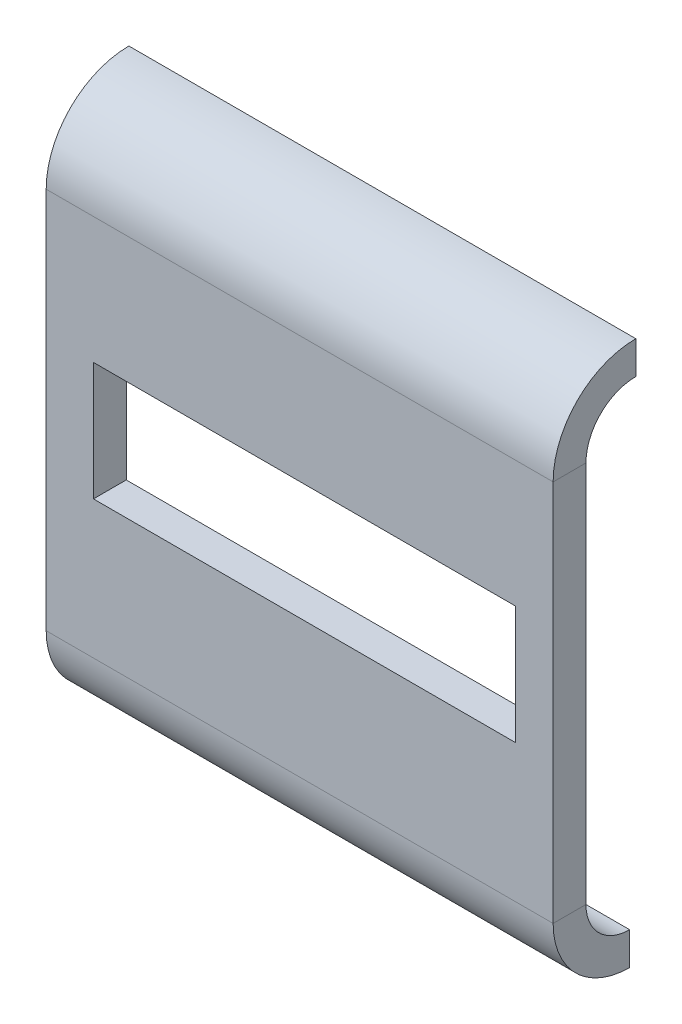
ISO-10303-21;
HEADER;
FILE_DESCRIPTION(('STEP AP214'),'2;1');
FILE_NAME('part.step','',(''),(''),'','','');
FILE_SCHEMA(('AUTOMOTIVE_DESIGN { 1 0 10303 214 1 1 1 1 }'));
ENDSEC;
DATA;
#1=APPLICATION_CONTEXT('core data for automotive mechanical design processes');
#2=APPLICATION_PROTOCOL_DEFINITION('international standard','automotive_design',2000,#1);
#3=PRODUCT_CONTEXT('',#1,'mechanical');
#4=PRODUCT('Part','Part','',(#3));
#5=PRODUCT_RELATED_PRODUCT_CATEGORY('part','',(#4));
#6=PRODUCT_DEFINITION_FORMATION('','',#4);
#7=PRODUCT_DEFINITION_CONTEXT('part definition',#1,'design');
#8=PRODUCT_DEFINITION('design','',#6,#7);
#9=PRODUCT_DEFINITION_SHAPE('','',#8);
#10=(LENGTH_UNIT() NAMED_UNIT(*) SI_UNIT(.MILLI.,.METRE.));
#11=(NAMED_UNIT(*) PLANE_ANGLE_UNIT() SI_UNIT($,.RADIAN.));
#12=(NAMED_UNIT(*) SI_UNIT($,.STERADIAN.) SOLID_ANGLE_UNIT());
#13=UNCERTAINTY_MEASURE_WITH_UNIT(LENGTH_MEASURE(1.E-05),#10,'distance_accuracy_value','');
#14=(GEOMETRIC_REPRESENTATION_CONTEXT(3) GLOBAL_UNCERTAINTY_ASSIGNED_CONTEXT((#13)) GLOBAL_UNIT_ASSIGNED_CONTEXT((#10,
#11,#12)) REPRESENTATION_CONTEXT('',''));
#15=CARTESIAN_POINT('',(0.,0.,0.));
#16=DIRECTION('',(0.,0.,1.));
#17=DIRECTION('',(1.,0.,0.));
#18=AXIS2_PLACEMENT_3D('',#15,#16,#17);
#19=CARTESIAN_POINT('',(3.77338304546715,-89.1498756984959,-22.54));
#20=DIRECTION('',(0.,0.,-1.));
#21=DIRECTION('',(1.,0.,0.));
#22=AXIS2_PLACEMENT_3D('',#19,#20,#21);
#23=PLANE('',#22);
#24=DIRECTION('',(0.,-1.,0.));
#25=VECTOR('',#24,1.);
#26=CARTESIAN_POINT('',(-79.3353785309465,-89.1498756984959,-22.54));
#27=LINE('',#26,#25);
#28=CARTESIAN_POINT('',(-79.3353785309465,-78.3878756984958,-22.54));
#29=VERTEX_POINT('',#28);
#30=CARTESIAN_POINT('',(-79.3353785309465,-89.1498756984959,-22.54));
#31=VERTEX_POINT('',#30);
#32=EDGE_CURVE('E235',#29,#31,#27,.T.);
#33=ORIENTED_EDGE('',*,*,#32,.F.);
#34=DIRECTION('',(-1.,0.,0.));
#35=VECTOR('',#34,1.);
#36=CARTESIAN_POINT('',(0.,-78.3878756984958,-22.54));
#37=LINE('',#36,#35);
#38=CARTESIAN_POINT('',(86.8821446218808,-78.3878756984958,-22.54));
#39=VERTEX_POINT('',#38);
#40=EDGE_CURVE('E209',#29,#39,#37,.F.);
#41=ORIENTED_EDGE('',*,*,#40,.T.);
#42=DIRECTION('',(0.,-1.,0.));
#43=VECTOR('',#42,1.);
#44=CARTESIAN_POINT('',(86.8821446218808,-89.1498756984959,-22.54));
#45=LINE('',#44,#43);
#46=CARTESIAN_POINT('',(86.8821446218808,-89.1498756984959,-22.54));
#47=VERTEX_POINT('',#46);
#48=EDGE_CURVE('E233',#39,#47,#45,.T.);
#49=ORIENTED_EDGE('',*,*,#48,.T.);
#50=DIRECTION('',(1.,0.,0.));
#51=VECTOR('',#50,1.);
#52=CARTESIAN_POINT('',(-79.3353785309465,-89.1498756984959,-22.54));
#53=LINE('',#52,#51);
#54=EDGE_CURVE('E178',#31,#47,#53,.T.);
#55=ORIENTED_EDGE('',*,*,#54,.F.);
#56=EDGE_LOOP('',(#33,#41,#49,#55));
#57=FACE_BOUND('',#56,.T.);
#58=ADVANCED_FACE('F45',(#57),#23,.T.);
#59=CARTESIAN_POINT('',(86.8821446218808,-64.0698756984958,-22.54));
#60=DIRECTION('',(-1.,0.,0.));
#61=DIRECTION('',(0.,0.,1.));
#62=AXIS2_PLACEMENT_3D('',#59,#60,#61);
#63=PLANE('',#62);
#64=ORIENTED_EDGE('',*,*,#48,.F.);
#65=CARTESIAN_POINT('',(86.8821446218808,-64.0698756984958,-22.54));
#66=DIRECTION('',(-1.,0.,0.));
#67=DIRECTION('',(0.,0.,1.));
#68=AXIS2_PLACEMENT_3D('',#65,#66,#67);
#69=CIRCLE('',#68,14.318);
#70=CARTESIAN_POINT('',(86.8821446218808,-64.0698756984958,-8.222));
#71=VERTEX_POINT('',#70);
#72=EDGE_CURVE('E160',#39,#71,#69,.T.);
#73=ORIENTED_EDGE('',*,*,#72,.T.);
#74=DIRECTION('',(0.,0.,1.));
#75=VECTOR('',#74,1.);
#76=CARTESIAN_POINT('',(86.8821446218808,-64.0698756984958,2.54));
#77=LINE('',#76,#75);
#78=CARTESIAN_POINT('',(86.8821446218808,-64.0698756984958,2.54));
#79=VERTEX_POINT('',#78);
#80=EDGE_CURVE('E231',#71,#79,#77,.T.);
#81=ORIENTED_EDGE('',*,*,#80,.T.);
#82=CARTESIAN_POINT('',(86.8821446218808,-64.0698756984958,-22.54));
#83=DIRECTION('',(1.,0.,0.));
#84=DIRECTION('',(0.,0.,-1.));
#85=AXIS2_PLACEMENT_3D('',#82,#83,#84);
#86=CIRCLE('',#85,25.08);
#87=EDGE_CURVE('E186',#47,#79,#86,.F.);
#88=ORIENTED_EDGE('',*,*,#87,.F.);
#89=EDGE_LOOP('',(#64,#73,#81,#88));
#90=FACE_BOUND('',#89,.T.);
#91=ADVANCED_FACE('F263',(#90),#63,.F.);
#92=CARTESIAN_POINT('',(86.8821446218808,88.4148194522112,2.54));
#93=DIRECTION('',(1.,0.,0.));
#94=DIRECTION('',(0.,1.,0.));
#95=AXIS2_PLACEMENT_3D('',#92,#93,#94);
#96=PLANE('',#95);
#97=ORIENTED_EDGE('',*,*,#80,.F.);
#98=DIRECTION('',(0.,1.,0.));
#99=VECTOR('',#98,1.);
#100=CARTESIAN_POINT('',(86.8821446218808,0.,-8.222));
#101=LINE('',#100,#99);
#102=CARTESIAN_POINT('',(86.8821446218808,61.3028194522112,-8.222));
#103=VERTEX_POINT('',#102);
#104=EDGE_CURVE('E200',#71,#103,#101,.T.);
#105=ORIENTED_EDGE('',*,*,#104,.T.);
#106=DIRECTION('',(0.,0.,1.));
#107=VECTOR('',#106,1.);
#108=CARTESIAN_POINT('',(86.8821446218808,61.3028194522112,2.54));
#109=LINE('',#108,#107);
#110=CARTESIAN_POINT('',(86.8821446218808,61.3028194522112,2.54));
#111=VERTEX_POINT('',#110);
#112=EDGE_CURVE('E229',#103,#111,#109,.T.);
#113=ORIENTED_EDGE('',*,*,#112,.T.);
#114=DIRECTION('',(0.,1.,0.));
#115=VECTOR('',#114,1.);
#116=CARTESIAN_POINT('',(86.8821446218808,88.4148194522112,2.54));
#117=LINE('',#116,#115);
#118=EDGE_CURVE('E166',#79,#111,#117,.T.);
#119=ORIENTED_EDGE('',*,*,#118,.F.);
#120=EDGE_LOOP('',(#97,#105,#113,#119));
#121=FACE_BOUND('',#120,.T.);
#122=ADVANCED_FACE('F268',(#121),#96,.T.);
#123=CARTESIAN_POINT('',(86.8821446218808,61.3028194522112,-24.572));
#124=DIRECTION('',(-1.,0.,0.));
#125=DIRECTION('',(0.,0.,1.));
#126=AXIS2_PLACEMENT_3D('',#123,#124,#125);
#127=PLANE('',#126);
#128=ORIENTED_EDGE('',*,*,#112,.F.);
#129=CARTESIAN_POINT('',(86.8821446218808,61.3028194522112,-24.572));
#130=DIRECTION('',(1.,0.,0.));
#131=DIRECTION('',(0.,0.,-1.));
#132=AXIS2_PLACEMENT_3D('',#129,#130,#131);
#133=CIRCLE('',#132,16.35);
#134=CARTESIAN_POINT('',(86.8821446218808,77.6528194522112,-24.572));
#135=VERTEX_POINT('',#134);
#136=EDGE_CURVE('E208',#103,#135,#133,.F.);
#137=ORIENTED_EDGE('',*,*,#136,.T.);
#138=DIRECTION('',(0.,1.,0.));
#139=VECTOR('',#138,1.);
#140=CARTESIAN_POINT('',(86.8821446218808,88.4148194522112,-24.572));
#141=LINE('',#140,#139);
#142=CARTESIAN_POINT('',(86.8821446218808,88.4148194522112,-24.572));
#143=VERTEX_POINT('',#142);
#144=EDGE_CURVE('E227',#135,#143,#141,.T.);
#145=ORIENTED_EDGE('',*,*,#144,.T.);
#146=CARTESIAN_POINT('',(86.8821446218808,61.3028194522112,-24.572));
#147=DIRECTION('',(1.,0.,0.));
#148=DIRECTION('',(0.,0.,-1.));
#149=AXIS2_PLACEMENT_3D('',#146,#147,#148);
#150=CIRCLE('',#149,27.112);
#151=EDGE_CURVE('E177',#111,#143,#150,.F.);
#152=ORIENTED_EDGE('',*,*,#151,.F.);
#153=EDGE_LOOP('',(#128,#137,#145,#152));
#154=FACE_BOUND('',#153,.T.);
#155=ADVANCED_FACE('F274',(#154),#127,.F.);
#156=CARTESIAN_POINT('',(3.77338304546714,88.4148194522112,-24.572));
#157=DIRECTION('',(0.,0.,-1.));
#158=DIRECTION('',(-1.,0.,0.));
#159=AXIS2_PLACEMENT_3D('',#156,#157,#158);
#160=PLANE('',#159);
#161=ORIENTED_EDGE('',*,*,#144,.F.);
#162=DIRECTION('',(1.,0.,0.));
#163=VECTOR('',#162,1.);
#164=CARTESIAN_POINT('',(0.,77.6528194522112,-24.572));
#165=LINE('',#164,#163);
#166=CARTESIAN_POINT('',(-79.3353785309465,77.6528194522112,-24.572));
#167=VERTEX_POINT('',#166);
#168=EDGE_CURVE('E204',#135,#167,#165,.F.);
#169=ORIENTED_EDGE('',*,*,#168,.T.);
#170=DIRECTION('',(0.,1.,0.));
#171=VECTOR('',#170,1.);
#172=CARTESIAN_POINT('',(-79.3353785309465,88.4148194522112,-24.572));
#173=LINE('',#172,#171);
#174=CARTESIAN_POINT('',(-79.3353785309465,88.4148194522112,-24.572));
#175=VERTEX_POINT('',#174);
#176=EDGE_CURVE('E225',#167,#175,#173,.T.);
#177=ORIENTED_EDGE('',*,*,#176,.T.);
#178=DIRECTION('',(-1.,0.,0.));
#179=VECTOR('',#178,1.);
#180=CARTESIAN_POINT('',(86.8821446218808,88.4148194522112,-24.572));
#181=LINE('',#180,#179);
#182=EDGE_CURVE('E167',#143,#175,#181,.T.);
#183=ORIENTED_EDGE('',*,*,#182,.F.);
#184=EDGE_LOOP('',(#161,#169,#177,#183));
#185=FACE_BOUND('',#184,.T.);
#186=ADVANCED_FACE('F278',(#185),#160,.T.);
#187=CARTESIAN_POINT('',(-79.3353785309465,61.3028194522112,-24.572));
#188=DIRECTION('',(1.,0.,0.));
#189=DIRECTION('',(0.,0.,-1.));
#190=AXIS2_PLACEMENT_3D('',#187,#188,#189);
#191=PLANE('',#190);
#192=ORIENTED_EDGE('',*,*,#176,.F.);
#193=CARTESIAN_POINT('',(-79.3353785309465,61.3028194522112,-24.572));
#194=DIRECTION('',(1.,0.,0.));
#195=DIRECTION('',(0.,0.,-1.));
#196=AXIS2_PLACEMENT_3D('',#193,#194,#195);
#197=CIRCLE('',#196,16.35);
#198=CARTESIAN_POINT('',(-79.3353785309465,61.3028194522112,-8.222));
#199=VERTEX_POINT('',#198);
#200=EDGE_CURVE('E205',#167,#199,#197,.T.);
#201=ORIENTED_EDGE('',*,*,#200,.T.);
#202=DIRECTION('',(0.,0.,1.));
#203=VECTOR('',#202,1.);
#204=CARTESIAN_POINT('',(-79.3353785309465,61.3028194522112,2.54));
#205=LINE('',#204,#203);
#206=CARTESIAN_POINT('',(-79.3353785309465,61.3028194522112,2.54));
#207=VERTEX_POINT('',#206);
#208=EDGE_CURVE('E223',#199,#207,#205,.T.);
#209=ORIENTED_EDGE('',*,*,#208,.T.);
#210=CARTESIAN_POINT('',(-79.3353785309465,61.3028194522112,-24.572));
#211=DIRECTION('',(-1.,0.,0.));
#212=DIRECTION('',(0.,0.,1.));
#213=AXIS2_PLACEMENT_3D('',#210,#211,#212);
#214=CIRCLE('',#213,27.112);
#215=EDGE_CURVE('E174',#175,#207,#214,.F.);
#216=ORIENTED_EDGE('',*,*,#215,.F.);
#217=EDGE_LOOP('',(#192,#201,#209,#216));
#218=FACE_BOUND('',#217,.T.);
#219=ADVANCED_FACE('F282',(#218),#191,.F.);
#220=CARTESIAN_POINT('',(-79.3353785309465,88.4148194522112,2.54));
#221=DIRECTION('',(-1.,0.,0.));
#222=DIRECTION('',(0.,-1.,0.));
#223=AXIS2_PLACEMENT_3D('',#220,#221,#222);
#224=PLANE('',#223);
#225=ORIENTED_EDGE('',*,*,#208,.F.);
#226=DIRECTION('',(0.,1.,0.));
#227=VECTOR('',#226,1.);
#228=CARTESIAN_POINT('',(-79.3353785309465,0.,-8.222));
#229=LINE('',#228,#227);
#230=CARTESIAN_POINT('',(-79.3353785309465,-64.0698756984958,-8.222));
#231=VERTEX_POINT('',#230);
#232=EDGE_CURVE('E201',#199,#231,#229,.F.);
#233=ORIENTED_EDGE('',*,*,#232,.T.);
#234=DIRECTION('',(0.,0.,1.));
#235=VECTOR('',#234,1.);
#236=CARTESIAN_POINT('',(-79.3353785309465,-64.0698756984958,2.54));
#237=LINE('',#236,#235);
#238=CARTESIAN_POINT('',(-79.3353785309465,-64.0698756984958,2.54));
#239=VERTEX_POINT('',#238);
#240=EDGE_CURVE('E185',#231,#239,#237,.T.);
#241=ORIENTED_EDGE('',*,*,#240,.T.);
#242=DIRECTION('',(0.,-1.,0.));
#243=VECTOR('',#242,1.);
#244=CARTESIAN_POINT('',(-79.3353785309465,88.4148194522112,2.54));
#245=LINE('',#244,#243);
#246=EDGE_CURVE('E163',#207,#239,#245,.T.);
#247=ORIENTED_EDGE('',*,*,#246,.F.);
#248=EDGE_LOOP('',(#225,#233,#241,#247));
#249=FACE_BOUND('',#248,.T.);
#250=ADVANCED_FACE('F286',(#249),#224,.T.);
#251=CARTESIAN_POINT('',(-79.3353785309465,-64.0698756984958,-22.54));
#252=DIRECTION('',(1.,0.,0.));
#253=DIRECTION('',(0.,0.,-1.));
#254=AXIS2_PLACEMENT_3D('',#251,#252,#253);
#255=PLANE('',#254);
#256=CARTESIAN_POINT('',(-79.3353785309465,-64.0698756984958,-22.54));
#257=DIRECTION('',(-1.,0.,0.));
#258=DIRECTION('',(0.,0.,1.));
#259=AXIS2_PLACEMENT_3D('',#256,#257,#258);
#260=CIRCLE('',#259,14.318);
#261=EDGE_CURVE('E218',#231,#29,#260,.F.);
#262=ORIENTED_EDGE('',*,*,#261,.T.);
#263=ORIENTED_EDGE('',*,*,#32,.T.);
#264=CARTESIAN_POINT('',(-79.3353785309465,-64.0698756984958,-22.54));
#265=DIRECTION('',(-1.,0.,0.));
#266=DIRECTION('',(0.,0.,1.));
#267=AXIS2_PLACEMENT_3D('',#264,#265,#266);
#268=CIRCLE('',#267,25.08);
#269=EDGE_CURVE('E189',#239,#31,#268,.F.);
#270=ORIENTED_EDGE('',*,*,#269,.F.);
#271=ORIENTED_EDGE('',*,*,#240,.F.);
#272=EDGE_LOOP('',(#262,#263,#270,#271));
#273=FACE_BOUND('',#272,.T.);
#274=ADVANCED_FACE('F47',(#273),#255,.F.);
#275=CARTESIAN_POINT('',(0.,0.,2.54));
#276=DIRECTION('',(0.,0.,1.));
#277=DIRECTION('',(1.,0.,0.));
#278=AXIS2_PLACEMENT_3D('',#275,#276,#277);
#279=PLANE('',#278);
#280=DIRECTION('',(0.,-1.,0.));
#281=VECTOR('',#280,1.);
#282=CARTESIAN_POINT('',(-63.8420034546598,19.878114837816,2.54));
#283=LINE('',#282,#281);
#284=CARTESIAN_POINT('',(-63.8420034546598,19.878114837816,2.54));
#285=VERTEX_POINT('',#284);
#286=CARTESIAN_POINT('',(-63.8420034546598,-18.8845321570687,2.54));
#287=VERTEX_POINT('',#286);
#288=EDGE_CURVE('E60',#285,#287,#283,.T.);
#289=ORIENTED_EDGE('',*,*,#288,.F.);
#290=DIRECTION('',(-1.,0.,0.));
#291=VECTOR('',#290,1.);
#292=CARTESIAN_POINT('',(-63.8420034546598,19.878114837816,2.54));
#293=LINE('',#292,#291);
#294=CARTESIAN_POINT('',(74.5459082148606,19.878114837816,2.54));
#295=VERTEX_POINT('',#294);
#296=EDGE_CURVE('E153',#295,#285,#293,.T.);
#297=ORIENTED_EDGE('',*,*,#296,.F.);
#298=DIRECTION('',(0.,1.,0.));
#299=VECTOR('',#298,1.);
#300=CARTESIAN_POINT('',(74.5459082148606,19.878114837816,2.54));
#301=LINE('',#300,#299);
#302=CARTESIAN_POINT('',(74.5459082148606,-18.8845321570687,2.54));
#303=VERTEX_POINT('',#302);
#304=EDGE_CURVE('E137',#303,#295,#301,.T.);
#305=ORIENTED_EDGE('',*,*,#304,.F.);
#306=DIRECTION('',(1.,0.,0.));
#307=VECTOR('',#306,1.);
#308=CARTESIAN_POINT('',(-63.8420034546598,-18.8845321570687,2.54));
#309=LINE('',#308,#307);
#310=EDGE_CURVE('E146',#287,#303,#309,.T.);
#311=ORIENTED_EDGE('',*,*,#310,.F.);
#312=EDGE_LOOP('',(#289,#297,#305,#311));
#313=FACE_BOUND('',#312,.T.);
#314=ORIENTED_EDGE('',*,*,#246,.T.);
#315=DIRECTION('',(1.,0.,0.));
#316=VECTOR('',#315,1.);
#317=CARTESIAN_POINT('',(86.8821446218808,-64.0698756984958,2.54));
#318=LINE('',#317,#316);
#319=EDGE_CURVE('E173',#239,#79,#318,.T.);
#320=ORIENTED_EDGE('',*,*,#319,.T.);
#321=ORIENTED_EDGE('',*,*,#118,.T.);
#322=DIRECTION('',(-1.,0.,0.));
#323=VECTOR('',#322,1.);
#324=CARTESIAN_POINT('',(-79.3353785309465,61.3028194522112,2.54));
#325=LINE('',#324,#323);
#326=EDGE_CURVE('E170',#111,#207,#325,.T.);
#327=ORIENTED_EDGE('',*,*,#326,.T.);
#328=EDGE_LOOP('',(#314,#320,#321,#327));
#329=FACE_BOUND('',#328,.T.);
#330=ADVANCED_FACE('F150',(#313,#329),#279,.T.);
#331=CARTESIAN_POINT('',(0.,61.3028194522112,-24.572));
#332=DIRECTION('',(1.,0.,0.));
#333=DIRECTION('',(0.,0.,-1.));
#334=AXIS2_PLACEMENT_3D('',#331,#332,#333);
#335=CYLINDRICAL_SURFACE('',#334,27.112);
#336=ORIENTED_EDGE('',*,*,#151,.T.);
#337=ORIENTED_EDGE('',*,*,#182,.T.);
#338=ORIENTED_EDGE('',*,*,#215,.T.);
#339=ORIENTED_EDGE('',*,*,#326,.F.);
#340=EDGE_LOOP('',(#336,#337,#338,#339));
#341=FACE_BOUND('',#340,.T.);
#342=ADVANCED_FACE('F298',(#341),#335,.T.);
#343=CARTESIAN_POINT('',(0.,-64.0698756984958,-22.54));
#344=DIRECTION('',(-1.,0.,0.));
#345=DIRECTION('',(0.,0.,1.));
#346=AXIS2_PLACEMENT_3D('',#343,#344,#345);
#347=CYLINDRICAL_SURFACE('',#346,25.08);
#348=ORIENTED_EDGE('',*,*,#269,.T.);
#349=ORIENTED_EDGE('',*,*,#54,.T.);
#350=ORIENTED_EDGE('',*,*,#87,.T.);
#351=ORIENTED_EDGE('',*,*,#319,.F.);
#352=EDGE_LOOP('',(#348,#349,#350,#351));
#353=FACE_BOUND('',#352,.T.);
#354=ADVANCED_FACE('F295',(#353),#347,.T.);
#355=CARTESIAN_POINT('',(0.,0.,-8.222));
#356=DIRECTION('',(0.,0.,1.));
#357=DIRECTION('',(1.,0.,0.));
#358=AXIS2_PLACEMENT_3D('',#355,#356,#357);
#359=PLANE('',#358);
#360=DIRECTION('',(-1.,0.,0.));
#361=VECTOR('',#360,1.);
#362=CARTESIAN_POINT('',(0.,19.878114837816,-8.222));
#363=LINE('',#362,#361);
#364=CARTESIAN_POINT('',(74.5459082148606,19.878114837816,-8.222));
#365=VERTEX_POINT('',#364);
#366=CARTESIAN_POINT('',(-63.8420034546598,19.878114837816,-8.222));
#367=VERTEX_POINT('',#366);
#368=EDGE_CURVE('E53',#365,#367,#363,.T.);
#369=ORIENTED_EDGE('',*,*,#368,.T.);
#370=DIRECTION('',(0.,-1.,0.));
#371=VECTOR('',#370,1.);
#372=CARTESIAN_POINT('',(-63.8420034546598,0.,-8.222));
#373=LINE('',#372,#371);
#374=CARTESIAN_POINT('',(-63.8420034546598,-18.8845321570687,-8.222));
#375=VERTEX_POINT('',#374);
#376=EDGE_CURVE('E11',#367,#375,#373,.T.);
#377=ORIENTED_EDGE('',*,*,#376,.T.);
#378=DIRECTION('',(1.,0.,0.));
#379=VECTOR('',#378,1.);
#380=CARTESIAN_POINT('',(0.,-18.8845321570687,-8.222));
#381=LINE('',#380,#379);
#382=CARTESIAN_POINT('',(74.5459082148606,-18.8845321570687,-8.222));
#383=VERTEX_POINT('',#382);
#384=EDGE_CURVE('E237',#375,#383,#381,.T.);
#385=ORIENTED_EDGE('',*,*,#384,.T.);
#386=DIRECTION('',(0.,1.,0.));
#387=VECTOR('',#386,1.);
#388=CARTESIAN_POINT('',(74.5459082148606,0.,-8.222));
#389=LINE('',#388,#387);
#390=EDGE_CURVE('E140',#383,#365,#389,.T.);
#391=ORIENTED_EDGE('',*,*,#390,.T.);
#392=EDGE_LOOP('',(#369,#377,#385,#391));
#393=FACE_BOUND('',#392,.T.);
#394=ORIENTED_EDGE('',*,*,#232,.F.);
#395=DIRECTION('',(1.,0.,0.));
#396=VECTOR('',#395,1.);
#397=CARTESIAN_POINT('',(0.,61.3028194522112,-8.222));
#398=LINE('',#397,#396);
#399=EDGE_CURVE('E197',#103,#199,#398,.F.);
#400=ORIENTED_EDGE('',*,*,#399,.F.);
#401=ORIENTED_EDGE('',*,*,#104,.F.);
#402=DIRECTION('',(1.,0.,0.));
#403=VECTOR('',#402,1.);
#404=CARTESIAN_POINT('',(0.,-64.0698756984958,-8.222));
#405=LINE('',#404,#403);
#406=EDGE_CURVE('E190',#231,#71,#405,.T.);
#407=ORIENTED_EDGE('',*,*,#406,.F.);
#408=EDGE_LOOP('',(#394,#400,#401,#407));
#409=FACE_BOUND('',#408,.T.);
#410=ADVANCED_FACE('F242',(#393,#409),#359,.F.);
#411=CARTESIAN_POINT('',(0.,61.3028194522112,-24.572));
#412=DIRECTION('',(1.,0.,0.));
#413=DIRECTION('',(0.,0.,-1.));
#414=AXIS2_PLACEMENT_3D('',#411,#412,#413);
#415=CYLINDRICAL_SURFACE('',#414,16.35);
#416=ORIENTED_EDGE('',*,*,#136,.F.);
#417=ORIENTED_EDGE('',*,*,#399,.T.);
#418=ORIENTED_EDGE('',*,*,#200,.F.);
#419=ORIENTED_EDGE('',*,*,#168,.F.);
#420=EDGE_LOOP('',(#416,#417,#418,#419));
#421=FACE_BOUND('',#420,.T.);
#422=ADVANCED_FACE('F257',(#421),#415,.F.);
#423=CARTESIAN_POINT('',(0.,-64.0698756984958,-22.54));
#424=DIRECTION('',(-1.,0.,0.));
#425=DIRECTION('',(0.,0.,1.));
#426=AXIS2_PLACEMENT_3D('',#423,#424,#425);
#427=CYLINDRICAL_SURFACE('',#426,14.318);
#428=ORIENTED_EDGE('',*,*,#261,.F.);
#429=ORIENTED_EDGE('',*,*,#406,.T.);
#430=ORIENTED_EDGE('',*,*,#72,.F.);
#431=ORIENTED_EDGE('',*,*,#40,.F.);
#432=EDGE_LOOP('',(#428,#429,#430,#431));
#433=FACE_BOUND('',#432,.T.);
#434=ADVANCED_FACE('F249',(#433),#427,.F.);
#435=CARTESIAN_POINT('',(-63.8420034546598,19.878114837816,-24.572));
#436=DIRECTION('',(-1.,0.,0.));
#437=DIRECTION('',(0.,0.,1.));
#438=AXIS2_PLACEMENT_3D('',#435,#436,#437);
#439=PLANE('',#438);
#440=DIRECTION('',(0.,0.,1.));
#441=VECTOR('',#440,1.);
#442=CARTESIAN_POINT('',(-63.8420034546598,19.878114837816,-24.572));
#443=LINE('',#442,#441);
#444=EDGE_CURVE('E158',#367,#285,#443,.T.);
#445=ORIENTED_EDGE('',*,*,#444,.T.);
#446=ORIENTED_EDGE('',*,*,#288,.T.);
#447=DIRECTION('',(0.,0.,1.));
#448=VECTOR('',#447,1.);
#449=CARTESIAN_POINT('',(-63.8420034546598,-18.8845321570687,-24.572));
#450=LINE('',#449,#448);
#451=EDGE_CURVE('E143',#375,#287,#450,.T.);
#452=ORIENTED_EDGE('',*,*,#451,.F.);
#453=ORIENTED_EDGE('',*,*,#376,.F.);
#454=EDGE_LOOP('',(#445,#446,#452,#453));
#455=FACE_BOUND('',#454,.T.);
#456=ADVANCED_FACE('F247',(#455),#439,.F.);
#457=CARTESIAN_POINT('',(-63.8420034546598,19.878114837816,-24.572));
#458=DIRECTION('',(0.,1.,0.));
#459=DIRECTION('',(0.,0.,1.));
#460=AXIS2_PLACEMENT_3D('',#457,#458,#459);
#461=PLANE('',#460);
#462=DIRECTION('',(0.,0.,1.));
#463=VECTOR('',#462,1.);
#464=CARTESIAN_POINT('',(74.5459082148606,19.878114837816,-24.572));
#465=LINE('',#464,#463);
#466=EDGE_CURVE('E142',#365,#295,#465,.T.);
#467=ORIENTED_EDGE('',*,*,#466,.T.);
#468=ORIENTED_EDGE('',*,*,#296,.T.);
#469=ORIENTED_EDGE('',*,*,#444,.F.);
#470=ORIENTED_EDGE('',*,*,#368,.F.);
#471=EDGE_LOOP('',(#467,#468,#469,#470));
#472=FACE_BOUND('',#471,.T.);
#473=ADVANCED_FACE('F246',(#472),#461,.F.);
#474=CARTESIAN_POINT('',(74.5459082148606,19.878114837816,-24.572));
#475=DIRECTION('',(1.,0.,0.));
#476=DIRECTION('',(0.,0.,-1.));
#477=AXIS2_PLACEMENT_3D('',#474,#475,#476);
#478=PLANE('',#477);
#479=DIRECTION('',(0.,0.,1.));
#480=VECTOR('',#479,1.);
#481=CARTESIAN_POINT('',(74.5459082148606,-18.8845321570687,-24.572));
#482=LINE('',#481,#480);
#483=EDGE_CURVE('E68',#383,#303,#482,.T.);
#484=ORIENTED_EDGE('',*,*,#483,.T.);
#485=ORIENTED_EDGE('',*,*,#304,.T.);
#486=ORIENTED_EDGE('',*,*,#466,.F.);
#487=ORIENTED_EDGE('',*,*,#390,.F.);
#488=EDGE_LOOP('',(#484,#485,#486,#487));
#489=FACE_BOUND('',#488,.T.);
#490=ADVANCED_FACE('F134',(#489),#478,.F.);
#491=CARTESIAN_POINT('',(-63.8420034546598,-18.8845321570687,-24.572));
#492=DIRECTION('',(0.,-1.,0.));
#493=DIRECTION('',(0.,0.,-1.));
#494=AXIS2_PLACEMENT_3D('',#491,#492,#493);
#495=PLANE('',#494);
#496=ORIENTED_EDGE('',*,*,#451,.T.);
#497=ORIENTED_EDGE('',*,*,#310,.T.);
#498=ORIENTED_EDGE('',*,*,#483,.F.);
#499=ORIENTED_EDGE('',*,*,#384,.F.);
#500=EDGE_LOOP('',(#496,#497,#498,#499));
#501=FACE_BOUND('',#500,.T.);
#502=ADVANCED_FACE('F147',(#501),#495,.F.);
#503=CLOSED_SHELL('',(#58,#91,#122,#155,#186,#219,#250,#274,#330,#342,#354,#410,#422,#434,#456,
#473,#490,#502));
#504=MANIFOLD_SOLID_BREP('B2',#503);
#505=ADVANCED_BREP_SHAPE_REPRESENTATION('',(#18,#504),#14);
#506=SHAPE_DEFINITION_REPRESENTATION(#9,#505);
ENDSEC;
END-ISO-10303-21;
